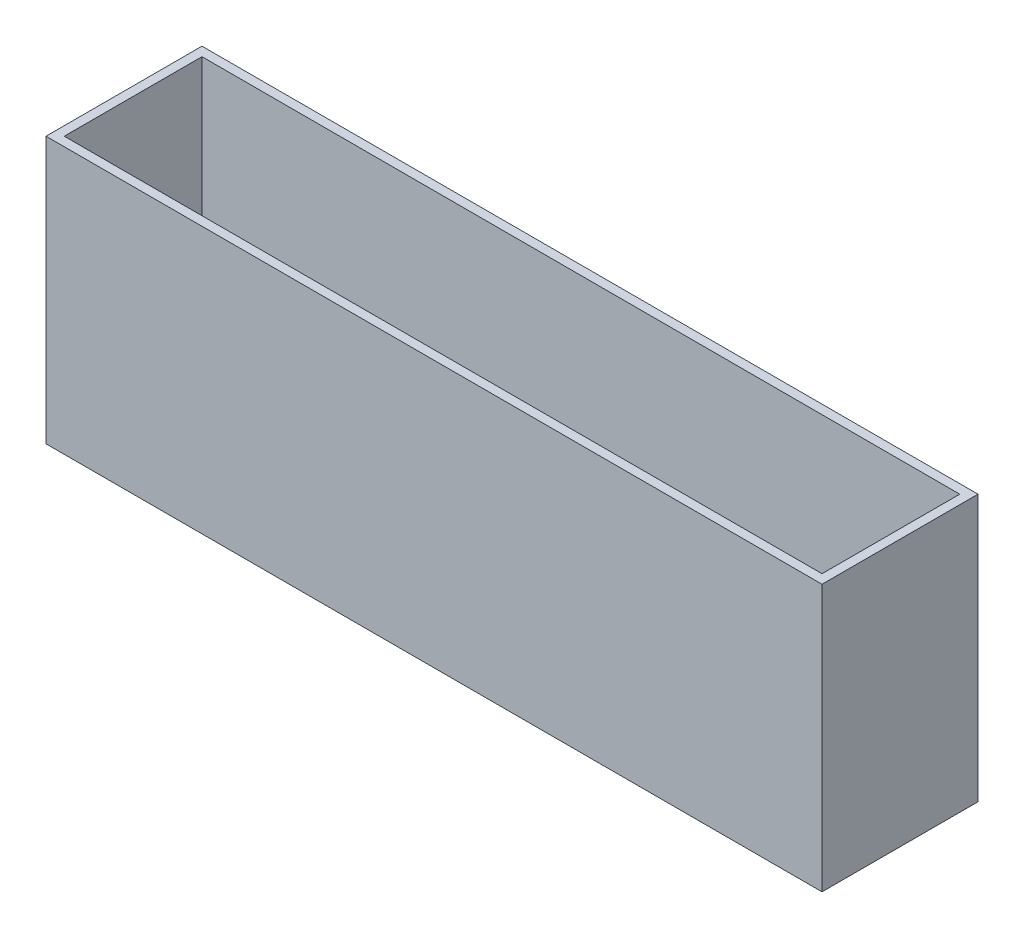
ISO-10303-21;
HEADER;
FILE_DESCRIPTION(('STEP AP214'),'2;1');
FILE_NAME('part.step','',(''),(''),'','','');
FILE_SCHEMA(('AUTOMOTIVE_DESIGN { 1 0 10303 214 1 1 1 1 }'));
ENDSEC;
DATA;
#1=APPLICATION_CONTEXT('core data for automotive mechanical design processes');
#2=APPLICATION_PROTOCOL_DEFINITION('international standard','automotive_design',2000,#1);
#3=PRODUCT_CONTEXT('',#1,'mechanical');
#4=PRODUCT('Part','Part','',(#3));
#5=PRODUCT_RELATED_PRODUCT_CATEGORY('part','',(#4));
#6=PRODUCT_DEFINITION_FORMATION('','',#4);
#7=PRODUCT_DEFINITION_CONTEXT('part definition',#1,'design');
#8=PRODUCT_DEFINITION('design','',#6,#7);
#9=PRODUCT_DEFINITION_SHAPE('','',#8);
#10=(LENGTH_UNIT() NAMED_UNIT(*) SI_UNIT(.MILLI.,.METRE.));
#11=(NAMED_UNIT(*) PLANE_ANGLE_UNIT() SI_UNIT($,.RADIAN.));
#12=(NAMED_UNIT(*) SI_UNIT($,.STERADIAN.) SOLID_ANGLE_UNIT());
#13=UNCERTAINTY_MEASURE_WITH_UNIT(LENGTH_MEASURE(1.E-05),#10,'distance_accuracy_value','');
#14=(GEOMETRIC_REPRESENTATION_CONTEXT(3) GLOBAL_UNCERTAINTY_ASSIGNED_CONTEXT((#13)) GLOBAL_UNIT_ASSIGNED_CONTEXT((#10,
#11,#12)) REPRESENTATION_CONTEXT('',''));
#15=CARTESIAN_POINT('',(0.,0.,0.));
#16=DIRECTION('',(0.,0.,1.));
#17=DIRECTION('',(1.,0.,0.));
#18=AXIS2_PLACEMENT_3D('',#15,#16,#17);
#19=CARTESIAN_POINT('',(-218.841848041994,35.7162366274568,51.308));
#20=DIRECTION('',(0.,-1.,0.));
#21=DIRECTION('',(0.,0.,-1.));
#22=AXIS2_PLACEMENT_3D('',#19,#20,#21);
#23=PLANE('',#22);
#24=DIRECTION('',(-1.,0.,0.));
#25=VECTOR('',#24,1.);
#26=CARTESIAN_POINT('',(-218.841848041994,35.7162366274568,0.));
#27=LINE('',#26,#25);
#28=CARTESIAN_POINT('',(36.4215519580081,35.7162366274568,0.));
#29=VERTEX_POINT('',#28);
#30=CARTESIAN_POINT('',(-218.841848041994,35.7162366274568,0.));
#31=VERTEX_POINT('',#30);
#32=EDGE_CURVE('E78',#29,#31,#27,.T.);
#33=ORIENTED_EDGE('',*,*,#32,.T.);
#34=DIRECTION('',(0.,0.,-1.));
#35=VECTOR('',#34,1.);
#36=CARTESIAN_POINT('',(-218.841848041994,35.7162366274568,51.308));
#37=LINE('',#36,#35);
#38=CARTESIAN_POINT('',(-218.841848041994,35.7162366274568,51.308));
#39=VERTEX_POINT('',#38);
#40=EDGE_CURVE('E150',#39,#31,#37,.T.);
#41=ORIENTED_EDGE('',*,*,#40,.F.);
#42=DIRECTION('',(-1.,0.,0.));
#43=VECTOR('',#42,1.);
#44=CARTESIAN_POINT('',(-218.841848041994,35.7162366274568,51.308));
#45=LINE('',#44,#43);
#46=CARTESIAN_POINT('',(36.4215519580081,35.7162366274568,51.308));
#47=VERTEX_POINT('',#46);
#48=EDGE_CURVE('E57',#47,#39,#45,.T.);
#49=ORIENTED_EDGE('',*,*,#48,.F.);
#50=DIRECTION('',(0.,0.,-1.));
#51=VECTOR('',#50,1.);
#52=CARTESIAN_POINT('',(36.4215519580081,35.7162366274568,51.308));
#53=LINE('',#52,#51);
#54=EDGE_CURVE('E160',#47,#29,#53,.T.);
#55=ORIENTED_EDGE('',*,*,#54,.T.);
#56=EDGE_LOOP('',(#33,#41,#49,#55));
#57=FACE_BOUND('',#56,.T.);
#58=DIRECTION('',(-1.,0.,0.));
#59=VECTOR('',#58,1.);
#60=CARTESIAN_POINT('',(-218.841848041994,35.7162366274568,3.));
#61=LINE('',#60,#59);
#62=CARTESIAN_POINT('',(33.4215519580081,35.7162366274568,3.));
#63=VERTEX_POINT('',#62);
#64=CARTESIAN_POINT('',(-215.841848041994,35.7162366274568,3.));
#65=VERTEX_POINT('',#64);
#66=EDGE_CURVE('E131',#63,#65,#61,.T.);
#67=ORIENTED_EDGE('',*,*,#66,.F.);
#68=DIRECTION('',(0.,0.,-1.));
#69=VECTOR('',#68,1.);
#70=CARTESIAN_POINT('',(33.4215519580081,35.7162366274568,51.308));
#71=LINE('',#70,#69);
#72=CARTESIAN_POINT('',(33.4215519580081,35.7162366274568,48.308));
#73=VERTEX_POINT('',#72);
#74=EDGE_CURVE('E126',#73,#63,#71,.T.);
#75=ORIENTED_EDGE('',*,*,#74,.F.);
#76=DIRECTION('',(-1.,0.,0.));
#77=VECTOR('',#76,1.);
#78=CARTESIAN_POINT('',(-218.841848041994,35.7162366274568,48.308));
#79=LINE('',#78,#77);
#80=CARTESIAN_POINT('',(-215.841848041994,35.7162366274568,48.308));
#81=VERTEX_POINT('',#80);
#82=EDGE_CURVE('E48',#73,#81,#79,.T.);
#83=ORIENTED_EDGE('',*,*,#82,.T.);
#84=DIRECTION('',(0.,0.,-1.));
#85=VECTOR('',#84,1.);
#86=CARTESIAN_POINT('',(-215.841848041994,35.7162366274569,51.308));
#87=LINE('',#86,#85);
#88=EDGE_CURVE('E139',#81,#65,#87,.T.);
#89=ORIENTED_EDGE('',*,*,#88,.T.);
#90=EDGE_LOOP('',(#67,#75,#83,#89));
#91=FACE_BOUND('',#90,.T.);
#92=ADVANCED_FACE('F33',(#57,#91),#23,.F.);
#93=CARTESIAN_POINT('',(-218.841848041994,35.7162366274568,51.308));
#94=DIRECTION('',(1.,0.,0.));
#95=DIRECTION('',(0.,1.,0.));
#96=AXIS2_PLACEMENT_3D('',#93,#94,#95);
#97=PLANE('',#96);
#98=DIRECTION('',(0.,-1.,0.));
#99=VECTOR('',#98,1.);
#100=CARTESIAN_POINT('',(-218.841848041994,35.7162366274568,0.));
#101=LINE('',#100,#99);
#102=CARTESIAN_POINT('',(-218.841848041994,-51.9137633725431,0.));
#103=VERTEX_POINT('',#102);
#104=EDGE_CURVE('E151',#31,#103,#101,.T.);
#105=ORIENTED_EDGE('',*,*,#104,.T.);
#106=DIRECTION('',(0.,0.,-1.));
#107=VECTOR('',#106,1.);
#108=CARTESIAN_POINT('',(-218.841848041994,-51.9137633725431,51.308));
#109=LINE('',#108,#107);
#110=CARTESIAN_POINT('',(-218.841848041994,-51.9137633725431,51.308));
#111=VERTEX_POINT('',#110);
#112=EDGE_CURVE('E11',#111,#103,#109,.T.);
#113=ORIENTED_EDGE('',*,*,#112,.F.);
#114=DIRECTION('',(0.,-1.,0.));
#115=VECTOR('',#114,1.);
#116=CARTESIAN_POINT('',(-218.841848041994,35.7162366274568,51.308));
#117=LINE('',#116,#115);
#118=EDGE_CURVE('E144',#39,#111,#117,.T.);
#119=ORIENTED_EDGE('',*,*,#118,.F.);
#120=ORIENTED_EDGE('',*,*,#40,.T.);
#121=EDGE_LOOP('',(#105,#113,#119,#120));
#122=FACE_BOUND('',#121,.T.);
#123=ADVANCED_FACE('F35',(#122),#97,.F.);
#124=CARTESIAN_POINT('',(-218.841848041994,-51.9137633725431,51.308));
#125=DIRECTION('',(0.,1.,0.));
#126=DIRECTION('',(0.,0.,1.));
#127=AXIS2_PLACEMENT_3D('',#124,#125,#126);
#128=PLANE('',#127);
#129=DIRECTION('',(1.,0.,0.));
#130=VECTOR('',#129,1.);
#131=CARTESIAN_POINT('',(-218.841848041994,-51.9137633725431,0.));
#132=LINE('',#131,#130);
#133=CARTESIAN_POINT('',(36.4215519580081,-51.9137633725431,0.));
#134=VERTEX_POINT('',#133);
#135=EDGE_CURVE('E154',#103,#134,#132,.T.);
#136=ORIENTED_EDGE('',*,*,#135,.T.);
#137=DIRECTION('',(0.,0.,-1.));
#138=VECTOR('',#137,1.);
#139=CARTESIAN_POINT('',(36.4215519580081,-51.9137633725431,51.308));
#140=LINE('',#139,#138);
#141=CARTESIAN_POINT('',(36.4215519580081,-51.9137633725431,51.308));
#142=VERTEX_POINT('',#141);
#143=EDGE_CURVE('E41',#142,#134,#140,.T.);
#144=ORIENTED_EDGE('',*,*,#143,.F.);
#145=DIRECTION('',(1.,0.,0.));
#146=VECTOR('',#145,1.);
#147=CARTESIAN_POINT('',(-218.841848041994,-51.9137633725431,51.308));
#148=LINE('',#147,#146);
#149=EDGE_CURVE('E85',#111,#142,#148,.T.);
#150=ORIENTED_EDGE('',*,*,#149,.F.);
#151=ORIENTED_EDGE('',*,*,#112,.T.);
#152=EDGE_LOOP('',(#136,#144,#150,#151));
#153=FACE_BOUND('',#152,.T.);
#154=ADVANCED_FACE('F199',(#153),#128,.F.);
#155=CARTESIAN_POINT('',(36.4215519580081,35.7162366274568,51.308));
#156=DIRECTION('',(-1.,0.,0.));
#157=DIRECTION('',(0.,-1.,0.));
#158=AXIS2_PLACEMENT_3D('',#155,#156,#157);
#159=PLANE('',#158);
#160=DIRECTION('',(0.,1.,0.));
#161=VECTOR('',#160,1.);
#162=CARTESIAN_POINT('',(36.4215519580081,35.7162366274568,0.));
#163=LINE('',#162,#161);
#164=EDGE_CURVE('E156',#134,#29,#163,.T.);
#165=ORIENTED_EDGE('',*,*,#164,.T.);
#166=ORIENTED_EDGE('',*,*,#54,.F.);
#167=DIRECTION('',(0.,1.,0.));
#168=VECTOR('',#167,1.);
#169=CARTESIAN_POINT('',(36.4215519580081,35.7162366274568,51.308));
#170=LINE('',#169,#168);
#171=EDGE_CURVE('E147',#142,#47,#170,.T.);
#172=ORIENTED_EDGE('',*,*,#171,.F.);
#173=ORIENTED_EDGE('',*,*,#143,.T.);
#174=EDGE_LOOP('',(#165,#166,#172,#173));
#175=FACE_BOUND('',#174,.T.);
#176=ADVANCED_FACE('F165',(#175),#159,.F.);
#177=CARTESIAN_POINT('',(0.,0.,51.308));
#178=DIRECTION('',(0.,0.,1.));
#179=DIRECTION('',(1.,0.,0.));
#180=AXIS2_PLACEMENT_3D('',#177,#178,#179);
#181=PLANE('',#180);
#182=ORIENTED_EDGE('',*,*,#118,.T.);
#183=ORIENTED_EDGE('',*,*,#149,.T.);
#184=ORIENTED_EDGE('',*,*,#171,.T.);
#185=ORIENTED_EDGE('',*,*,#48,.T.);
#186=EDGE_LOOP('',(#182,#183,#184,#185));
#187=FACE_BOUND('',#186,.T.);
#188=ADVANCED_FACE('F193',(#187),#181,.T.);
#189=CARTESIAN_POINT('',(0.,0.,0.));
#190=DIRECTION('',(0.,0.,1.));
#191=DIRECTION('',(1.,0.,0.));
#192=AXIS2_PLACEMENT_3D('',#189,#190,#191);
#193=PLANE('',#192);
#194=ORIENTED_EDGE('',*,*,#104,.F.);
#195=ORIENTED_EDGE('',*,*,#32,.F.);
#196=ORIENTED_EDGE('',*,*,#164,.F.);
#197=ORIENTED_EDGE('',*,*,#135,.F.);
#198=EDGE_LOOP('',(#194,#195,#196,#197));
#199=FACE_BOUND('',#198,.T.);
#200=ADVANCED_FACE('F169',(#199),#193,.F.);
#201=CARTESIAN_POINT('',(-215.841848041994,35.7162366274569,51.308));
#202=DIRECTION('',(1.,0.,0.));
#203=DIRECTION('',(0.,1.,0.));
#204=AXIS2_PLACEMENT_3D('',#201,#202,#203);
#205=PLANE('',#204);
#206=DIRECTION('',(0.,-1.,0.));
#207=VECTOR('',#206,1.);
#208=CARTESIAN_POINT('',(-215.841848041994,35.7162366274569,3.));
#209=LINE('',#208,#207);
#210=CARTESIAN_POINT('',(-215.841848041994,-48.9137633725431,3.));
#211=VERTEX_POINT('',#210);
#212=EDGE_CURVE('E115',#65,#211,#209,.T.);
#213=ORIENTED_EDGE('',*,*,#212,.F.);
#214=ORIENTED_EDGE('',*,*,#88,.F.);
#215=DIRECTION('',(0.,-1.,0.));
#216=VECTOR('',#215,1.);
#217=CARTESIAN_POINT('',(-215.841848041994,35.7162366274569,48.308));
#218=LINE('',#217,#216);
#219=CARTESIAN_POINT('',(-215.841848041994,-48.9137633725431,48.308));
#220=VERTEX_POINT('',#219);
#221=EDGE_CURVE('E133',#81,#220,#218,.T.);
#222=ORIENTED_EDGE('',*,*,#221,.T.);
#223=DIRECTION('',(0.,0.,-1.));
#224=VECTOR('',#223,1.);
#225=CARTESIAN_POINT('',(-215.841848041994,-48.9137633725431,51.308));
#226=LINE('',#225,#224);
#227=EDGE_CURVE('E125',#220,#211,#226,.T.);
#228=ORIENTED_EDGE('',*,*,#227,.T.);
#229=EDGE_LOOP('',(#213,#214,#222,#228));
#230=FACE_BOUND('',#229,.T.);
#231=ADVANCED_FACE('F177',(#230),#205,.T.);
#232=CARTESIAN_POINT('',(-218.841848041994,-48.9137633725431,51.308));
#233=DIRECTION('',(0.,1.,0.));
#234=DIRECTION('',(0.,0.,1.));
#235=AXIS2_PLACEMENT_3D('',#232,#233,#234);
#236=PLANE('',#235);
#237=DIRECTION('',(1.,0.,0.));
#238=VECTOR('',#237,1.);
#239=CARTESIAN_POINT('',(-218.841848041994,-48.9137633725431,3.));
#240=LINE('',#239,#238);
#241=CARTESIAN_POINT('',(33.4215519580081,-48.9137633725431,3.));
#242=VERTEX_POINT('',#241);
#243=EDGE_CURVE('E108',#211,#242,#240,.T.);
#244=ORIENTED_EDGE('',*,*,#243,.F.);
#245=ORIENTED_EDGE('',*,*,#227,.F.);
#246=DIRECTION('',(1.,0.,0.));
#247=VECTOR('',#246,1.);
#248=CARTESIAN_POINT('',(-218.841848041994,-48.9137633725431,48.308));
#249=LINE('',#248,#247);
#250=CARTESIAN_POINT('',(33.4215519580081,-48.9137633725431,48.308));
#251=VERTEX_POINT('',#250);
#252=EDGE_CURVE('E123',#220,#251,#249,.T.);
#253=ORIENTED_EDGE('',*,*,#252,.T.);
#254=DIRECTION('',(0.,0.,-1.));
#255=VECTOR('',#254,1.);
#256=CARTESIAN_POINT('',(33.4215519580081,-48.9137633725431,51.308));
#257=LINE('',#256,#255);
#258=EDGE_CURVE('E121',#251,#242,#257,.T.);
#259=ORIENTED_EDGE('',*,*,#258,.T.);
#260=EDGE_LOOP('',(#244,#245,#253,#259));
#261=FACE_BOUND('',#260,.T.);
#262=ADVANCED_FACE('F122',(#261),#236,.T.);
#263=CARTESIAN_POINT('',(33.4215519580081,35.7162366274568,51.308));
#264=DIRECTION('',(-1.,0.,0.));
#265=DIRECTION('',(0.,-1.,0.));
#266=AXIS2_PLACEMENT_3D('',#263,#264,#265);
#267=PLANE('',#266);
#268=DIRECTION('',(0.,1.,0.));
#269=VECTOR('',#268,1.);
#270=CARTESIAN_POINT('',(33.4215519580081,35.7162366274568,3.));
#271=LINE('',#270,#269);
#272=EDGE_CURVE('E112',#242,#63,#271,.T.);
#273=ORIENTED_EDGE('',*,*,#272,.F.);
#274=ORIENTED_EDGE('',*,*,#258,.F.);
#275=DIRECTION('',(0.,1.,0.));
#276=VECTOR('',#275,1.);
#277=CARTESIAN_POINT('',(33.4215519580081,35.7162366274568,48.308));
#278=LINE('',#277,#276);
#279=EDGE_CURVE('E137',#251,#73,#278,.T.);
#280=ORIENTED_EDGE('',*,*,#279,.T.);
#281=ORIENTED_EDGE('',*,*,#74,.T.);
#282=EDGE_LOOP('',(#273,#274,#280,#281));
#283=FACE_BOUND('',#282,.T.);
#284=ADVANCED_FACE('F128',(#283),#267,.T.);
#285=CARTESIAN_POINT('',(0.,0.,48.308));
#286=DIRECTION('',(0.,0.,1.));
#287=DIRECTION('',(1.,0.,0.));
#288=AXIS2_PLACEMENT_3D('',#285,#286,#287);
#289=PLANE('',#288);
#290=ORIENTED_EDGE('',*,*,#221,.F.);
#291=ORIENTED_EDGE('',*,*,#82,.F.);
#292=ORIENTED_EDGE('',*,*,#279,.F.);
#293=ORIENTED_EDGE('',*,*,#252,.F.);
#294=EDGE_LOOP('',(#290,#291,#292,#293));
#295=FACE_BOUND('',#294,.T.);
#296=ADVANCED_FACE('F182',(#295),#289,.F.);
#297=CARTESIAN_POINT('',(0.,0.,3.));
#298=DIRECTION('',(0.,0.,1.));
#299=DIRECTION('',(1.,0.,0.));
#300=AXIS2_PLACEMENT_3D('',#297,#298,#299);
#301=PLANE('',#300);
#302=ORIENTED_EDGE('',*,*,#212,.T.);
#303=ORIENTED_EDGE('',*,*,#243,.T.);
#304=ORIENTED_EDGE('',*,*,#272,.T.);
#305=ORIENTED_EDGE('',*,*,#66,.T.);
#306=EDGE_LOOP('',(#302,#303,#304,#305));
#307=FACE_BOUND('',#306,.T.);
#308=ADVANCED_FACE('F110',(#307),#301,.T.);
#309=CLOSED_SHELL('',(#92,#123,#154,#176,#188,#200,#231,#262,#284,#296,#308));
#310=MANIFOLD_SOLID_BREP('B2',#309);
#311=ADVANCED_BREP_SHAPE_REPRESENTATION('',(#18,#310),#14);
#312=SHAPE_DEFINITION_REPRESENTATION(#9,#311);
ENDSEC;
END-ISO-10303-21;
